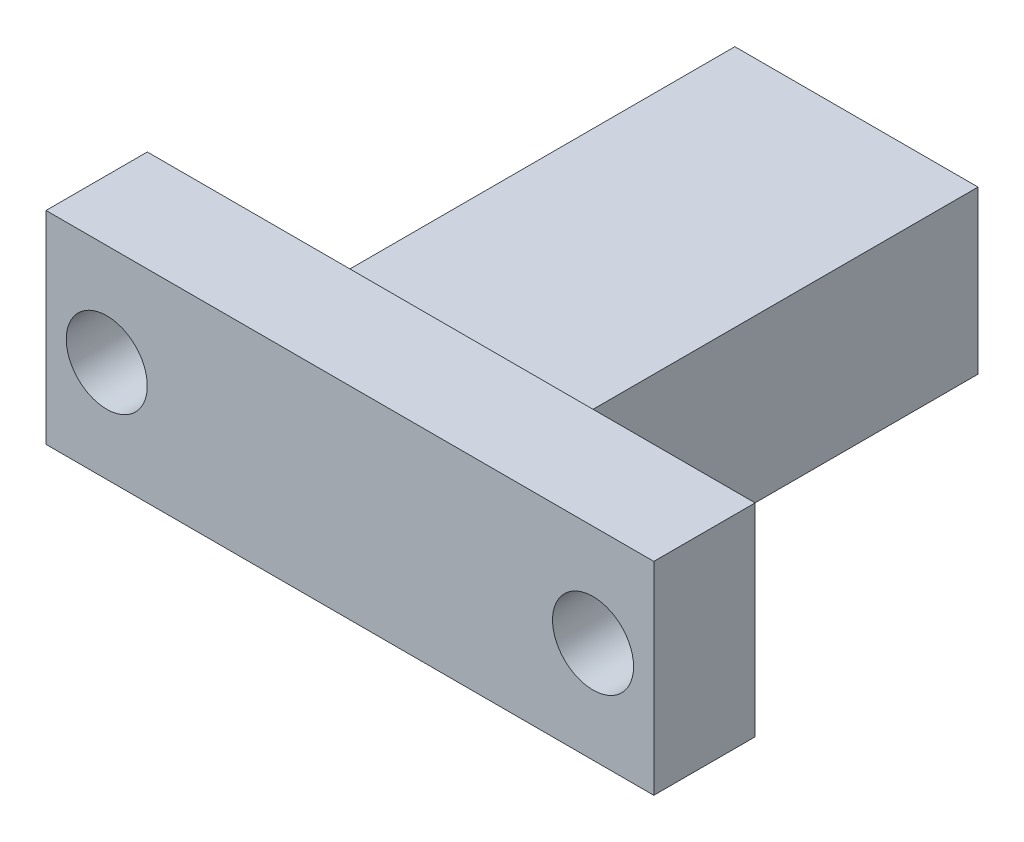
ISO-10303-21;
HEADER;
FILE_DESCRIPTION(('STEP AP214'),'2;1');
FILE_NAME('part.step','',(''),(''),'','','');
FILE_SCHEMA(('AUTOMOTIVE_DESIGN { 1 0 10303 214 1 1 1 1 }'));
ENDSEC;
DATA;
#1=APPLICATION_CONTEXT('core data for automotive mechanical design processes');
#2=APPLICATION_PROTOCOL_DEFINITION('international standard','automotive_design',2000,#1);
#3=PRODUCT_CONTEXT('',#1,'mechanical');
#4=PRODUCT('Part','Part','',(#3));
#5=PRODUCT_RELATED_PRODUCT_CATEGORY('part','',(#4));
#6=PRODUCT_DEFINITION_FORMATION('','',#4);
#7=PRODUCT_DEFINITION_CONTEXT('part definition',#1,'design');
#8=PRODUCT_DEFINITION('design','',#6,#7);
#9=PRODUCT_DEFINITION_SHAPE('','',#8);
#10=(LENGTH_UNIT() NAMED_UNIT(*) SI_UNIT(.MILLI.,.METRE.));
#11=(NAMED_UNIT(*) PLANE_ANGLE_UNIT() SI_UNIT($,.RADIAN.));
#12=(NAMED_UNIT(*) SI_UNIT($,.STERADIAN.) SOLID_ANGLE_UNIT());
#13=UNCERTAINTY_MEASURE_WITH_UNIT(LENGTH_MEASURE(1.E-05),#10,'distance_accuracy_value','');
#14=(GEOMETRIC_REPRESENTATION_CONTEXT(3) GLOBAL_UNCERTAINTY_ASSIGNED_CONTEXT((#13)) GLOBAL_UNIT_ASSIGNED_CONTEXT((#10,
#11,#12)) REPRESENTATION_CONTEXT('',''));
#15=CARTESIAN_POINT('',(0.,0.,0.));
#16=DIRECTION('',(0.,0.,1.));
#17=DIRECTION('',(1.,0.,0.));
#18=AXIS2_PLACEMENT_3D('',#15,#16,#17);
#19=CARTESIAN_POINT('',(0.,0.,0.));
#20=DIRECTION('',(0.,0.,-1.));
#21=DIRECTION('',(-1.,0.,0.));
#22=AXIS2_PLACEMENT_3D('',#19,#20,#21);
#23=PLANE('',#22);
#24=CARTESIAN_POINT('',(12.,0.,0.));
#25=DIRECTION('',(0.,0.,1.));
#26=DIRECTION('',(1.,0.,0.));
#27=AXIS2_PLACEMENT_3D('',#24,#25,#26);
#28=CIRCLE('',#27,2.);
#29=CARTESIAN_POINT('',(14.,0.,0.));
#30=VERTEX_POINT('',#29);
#31=EDGE_CURVE('E143',#30,#30,#28,.T.);
#32=ORIENTED_EDGE('',*,*,#31,.T.);
#33=EDGE_LOOP('',(#32));
#34=FACE_BOUND('',#33,.T.);
#35=DIRECTION('',(0.,1.,0.));
#36=VECTOR('',#35,1.);
#37=CARTESIAN_POINT('',(15.,-5.,0.));
#38=LINE('',#37,#36);
#39=CARTESIAN_POINT('',(15.,-5.,0.));
#40=VERTEX_POINT('',#39);
#41=CARTESIAN_POINT('',(15.,4.99999999999999,0.));
#42=VERTEX_POINT('',#41);
#43=EDGE_CURVE('E149',#40,#42,#38,.T.);
#44=ORIENTED_EDGE('',*,*,#43,.F.);
#45=DIRECTION('',(1.,0.,0.));
#46=VECTOR('',#45,1.);
#47=CARTESIAN_POINT('',(-15.,-5.,0.));
#48=LINE('',#47,#46);
#49=CARTESIAN_POINT('',(-15.,-5.,0.));
#50=VERTEX_POINT('',#49);
#51=EDGE_CURVE('E156',#50,#40,#48,.T.);
#52=ORIENTED_EDGE('',*,*,#51,.F.);
#53=DIRECTION('',(0.,-1.,0.));
#54=VECTOR('',#53,1.);
#55=CARTESIAN_POINT('',(-15.,-5.,0.));
#56=LINE('',#55,#54);
#57=CARTESIAN_POINT('',(-15.,4.99999999999999,0.));
#58=VERTEX_POINT('',#57);
#59=EDGE_CURVE('E167',#58,#50,#56,.T.);
#60=ORIENTED_EDGE('',*,*,#59,.F.);
#61=DIRECTION('',(-1.,0.,0.));
#62=VECTOR('',#61,1.);
#63=CARTESIAN_POINT('',(-15.,4.99999999999999,0.));
#64=LINE('',#63,#62);
#65=EDGE_CURVE('E165',#42,#58,#64,.T.);
#66=ORIENTED_EDGE('',*,*,#65,.F.);
#67=EDGE_LOOP('',(#44,#52,#60,#66));
#68=FACE_BOUND('',#67,.T.);
#69=CARTESIAN_POINT('',(-12.,0.,0.));
#70=DIRECTION('',(0.,0.,1.));
#71=DIRECTION('',(-1.,0.,0.));
#72=AXIS2_PLACEMENT_3D('',#69,#70,#71);
#73=CIRCLE('',#72,2.);
#74=CARTESIAN_POINT('',(-14.,0.,0.));
#75=VERTEX_POINT('',#74);
#76=EDGE_CURVE('E139',#75,#75,#73,.T.);
#77=ORIENTED_EDGE('',*,*,#76,.T.);
#78=EDGE_LOOP('',(#77));
#79=FACE_BOUND('',#78,.T.);
#80=DIRECTION('',(1.,0.,0.));
#81=VECTOR('',#80,1.);
#82=CARTESIAN_POINT('',(5.99999999999999,4.,0.));
#83=LINE('',#82,#81);
#84=CARTESIAN_POINT('',(-6.00000000000001,4.,0.));
#85=VERTEX_POINT('',#84);
#86=CARTESIAN_POINT('',(5.99999999999999,4.,0.));
#87=VERTEX_POINT('',#86);
#88=EDGE_CURVE('E218',#85,#87,#83,.T.);
#89=ORIENTED_EDGE('',*,*,#88,.F.);
#90=DIRECTION('',(0.,1.,0.));
#91=VECTOR('',#90,1.);
#92=CARTESIAN_POINT('',(-6.00000000000001,-4.,0.));
#93=LINE('',#92,#91);
#94=CARTESIAN_POINT('',(-6.00000000000001,-4.,0.));
#95=VERTEX_POINT('',#94);
#96=EDGE_CURVE('E119',#95,#85,#93,.T.);
#97=ORIENTED_EDGE('',*,*,#96,.F.);
#98=DIRECTION('',(-1.,0.,0.));
#99=VECTOR('',#98,1.);
#100=CARTESIAN_POINT('',(6.00000000000001,-4.,0.));
#101=LINE('',#100,#99);
#102=CARTESIAN_POINT('',(6.00000000000001,-4.,0.));
#103=VERTEX_POINT('',#102);
#104=EDGE_CURVE('E124',#103,#95,#101,.T.);
#105=ORIENTED_EDGE('',*,*,#104,.F.);
#106=DIRECTION('',(0.,-1.,0.));
#107=VECTOR('',#106,1.);
#108=CARTESIAN_POINT('',(6.00000000000001,-4.,0.));
#109=LINE('',#108,#107);
#110=EDGE_CURVE('E219',#87,#103,#109,.T.);
#111=ORIENTED_EDGE('',*,*,#110,.F.);
#112=EDGE_LOOP('',(#89,#97,#105,#111));
#113=FACE_BOUND('',#112,.T.);
#114=ADVANCED_FACE('F40',(#34,#68,#79,#113),#23,.T.);
#115=CARTESIAN_POINT('',(0.,0.,5.));
#116=DIRECTION('',(0.,0.,-1.));
#117=DIRECTION('',(-1.,0.,0.));
#118=AXIS2_PLACEMENT_3D('',#115,#116,#117);
#119=PLANE('',#118);
#120=DIRECTION('',(0.,1.,0.));
#121=VECTOR('',#120,1.);
#122=CARTESIAN_POINT('',(15.,-5.00000000000002,5.));
#123=LINE('',#122,#121);
#124=CARTESIAN_POINT('',(15.,-5.00000000000002,5.));
#125=VERTEX_POINT('',#124);
#126=CARTESIAN_POINT('',(15.,4.99999999999999,5.));
#127=VERTEX_POINT('',#126);
#128=EDGE_CURVE('E152',#125,#127,#123,.T.);
#129=ORIENTED_EDGE('',*,*,#128,.T.);
#130=DIRECTION('',(-1.,0.,0.));
#131=VECTOR('',#130,1.);
#132=CARTESIAN_POINT('',(-15.,4.99999999999999,5.));
#133=LINE('',#132,#131);
#134=CARTESIAN_POINT('',(-15.,4.99999999999999,5.));
#135=VERTEX_POINT('',#134);
#136=EDGE_CURVE('E155',#127,#135,#133,.T.);
#137=ORIENTED_EDGE('',*,*,#136,.T.);
#138=DIRECTION('',(0.,-1.,0.));
#139=VECTOR('',#138,1.);
#140=CARTESIAN_POINT('',(-15.,-5.00000000000002,5.));
#141=LINE('',#140,#139);
#142=CARTESIAN_POINT('',(-15.,-5.00000000000002,5.));
#143=VERTEX_POINT('',#142);
#144=EDGE_CURVE('E158',#135,#143,#141,.T.);
#145=ORIENTED_EDGE('',*,*,#144,.T.);
#146=DIRECTION('',(1.,0.,0.));
#147=VECTOR('',#146,1.);
#148=CARTESIAN_POINT('',(-15.,-5.00000000000002,5.));
#149=LINE('',#148,#147);
#150=EDGE_CURVE('E160',#143,#125,#149,.T.);
#151=ORIENTED_EDGE('',*,*,#150,.T.);
#152=EDGE_LOOP('',(#129,#137,#145,#151));
#153=FACE_BOUND('',#152,.T.);
#154=CARTESIAN_POINT('',(12.,0.,5.));
#155=DIRECTION('',(0.,0.,1.));
#156=DIRECTION('',(1.,0.,0.));
#157=AXIS2_PLACEMENT_3D('',#154,#155,#156);
#158=CIRCLE('',#157,2.);
#159=CARTESIAN_POINT('',(14.,0.,5.));
#160=VERTEX_POINT('',#159);
#161=EDGE_CURVE('E146',#160,#160,#158,.T.);
#162=ORIENTED_EDGE('',*,*,#161,.F.);
#163=EDGE_LOOP('',(#162));
#164=FACE_BOUND('',#163,.T.);
#165=CARTESIAN_POINT('',(-12.,0.,5.));
#166=DIRECTION('',(0.,0.,1.));
#167=DIRECTION('',(-1.,0.,0.));
#168=AXIS2_PLACEMENT_3D('',#165,#166,#167);
#169=CIRCLE('',#168,2.);
#170=CARTESIAN_POINT('',(-14.,0.,5.));
#171=VERTEX_POINT('',#170);
#172=EDGE_CURVE('E140',#171,#171,#169,.T.);
#173=ORIENTED_EDGE('',*,*,#172,.F.);
#174=EDGE_LOOP('',(#173));
#175=FACE_BOUND('',#174,.T.);
#176=ADVANCED_FACE('F198',(#153,#164,#175),#119,.F.);
#177=CARTESIAN_POINT('',(15.,-5.00000000000002,5.));
#178=DIRECTION('',(-1.,0.,0.));
#179=DIRECTION('',(0.,0.,1.));
#180=AXIS2_PLACEMENT_3D('',#177,#178,#179);
#181=PLANE('',#180);
#182=ORIENTED_EDGE('',*,*,#43,.T.);
#183=DIRECTION('',(0.,0.,-1.));
#184=VECTOR('',#183,1.);
#185=CARTESIAN_POINT('',(15.,4.99999999999999,5.));
#186=LINE('',#185,#184);
#187=EDGE_CURVE('E48',#127,#42,#186,.T.);
#188=ORIENTED_EDGE('',*,*,#187,.F.);
#189=ORIENTED_EDGE('',*,*,#128,.F.);
#190=DIRECTION('',(0.,0.,-1.));
#191=VECTOR('',#190,1.);
#192=CARTESIAN_POINT('',(15.,-5.00000000000002,5.));
#193=LINE('',#192,#191);
#194=EDGE_CURVE('E162',#125,#40,#193,.T.);
#195=ORIENTED_EDGE('',*,*,#194,.T.);
#196=EDGE_LOOP('',(#182,#188,#189,#195));
#197=FACE_BOUND('',#196,.T.);
#198=ADVANCED_FACE('F42',(#197),#181,.F.);
#199=CARTESIAN_POINT('',(-15.,4.99999999999999,5.));
#200=DIRECTION('',(0.,-1.,0.));
#201=DIRECTION('',(0.,0.,-1.));
#202=AXIS2_PLACEMENT_3D('',#199,#200,#201);
#203=PLANE('',#202);
#204=ORIENTED_EDGE('',*,*,#65,.T.);
#205=DIRECTION('',(0.,0.,-1.));
#206=VECTOR('',#205,1.);
#207=CARTESIAN_POINT('',(-15.,4.99999999999999,5.));
#208=LINE('',#207,#206);
#209=EDGE_CURVE('E175',#135,#58,#208,.T.);
#210=ORIENTED_EDGE('',*,*,#209,.F.);
#211=ORIENTED_EDGE('',*,*,#136,.F.);
#212=ORIENTED_EDGE('',*,*,#187,.T.);
#213=EDGE_LOOP('',(#204,#210,#211,#212));
#214=FACE_BOUND('',#213,.T.);
#215=ADVANCED_FACE('F180',(#214),#203,.F.);
#216=CARTESIAN_POINT('',(-15.,-5.00000000000002,5.));
#217=DIRECTION('',(1.,0.,0.));
#218=DIRECTION('',(0.,0.,-1.));
#219=AXIS2_PLACEMENT_3D('',#216,#217,#218);
#220=PLANE('',#219);
#221=ORIENTED_EDGE('',*,*,#59,.T.);
#222=DIRECTION('',(0.,0.,-1.));
#223=VECTOR('',#222,1.);
#224=CARTESIAN_POINT('',(-15.,-5.00000000000002,5.));
#225=LINE('',#224,#223);
#226=EDGE_CURVE('E172',#143,#50,#225,.T.);
#227=ORIENTED_EDGE('',*,*,#226,.F.);
#228=ORIENTED_EDGE('',*,*,#144,.F.);
#229=ORIENTED_EDGE('',*,*,#209,.T.);
#230=EDGE_LOOP('',(#221,#227,#228,#229));
#231=FACE_BOUND('',#230,.T.);
#232=ADVANCED_FACE('F192',(#231),#220,.F.);
#233=CARTESIAN_POINT('',(-15.,-5.00000000000002,5.));
#234=DIRECTION('',(0.,1.,0.));
#235=DIRECTION('',(0.,0.,1.));
#236=AXIS2_PLACEMENT_3D('',#233,#234,#235);
#237=PLANE('',#236);
#238=ORIENTED_EDGE('',*,*,#51,.T.);
#239=ORIENTED_EDGE('',*,*,#194,.F.);
#240=ORIENTED_EDGE('',*,*,#150,.F.);
#241=ORIENTED_EDGE('',*,*,#226,.T.);
#242=EDGE_LOOP('',(#238,#239,#240,#241));
#243=FACE_BOUND('',#242,.T.);
#244=ADVANCED_FACE('F196',(#243),#237,.F.);
#245=CARTESIAN_POINT('',(12.,0.,5.));
#246=DIRECTION('',(0.,0.,-1.));
#247=DIRECTION('',(-1.,0.,0.));
#248=AXIS2_PLACEMENT_3D('',#245,#246,#247);
#249=CYLINDRICAL_SURFACE('',#248,2.);
#250=ORIENTED_EDGE('',*,*,#161,.T.);
#251=EDGE_LOOP('',(#250));
#252=FACE_BOUND('',#251,.T.);
#253=ORIENTED_EDGE('',*,*,#31,.F.);
#254=EDGE_LOOP('',(#253));
#255=FACE_BOUND('',#254,.T.);
#256=ADVANCED_FACE('F209',(#252,#255),#249,.F.);
#257=CARTESIAN_POINT('',(-12.,0.,5.));
#258=DIRECTION('',(0.,0.,-1.));
#259=DIRECTION('',(-1.,0.,0.));
#260=AXIS2_PLACEMENT_3D('',#257,#258,#259);
#261=CYLINDRICAL_SURFACE('',#260,2.);
#262=ORIENTED_EDGE('',*,*,#172,.T.);
#263=EDGE_LOOP('',(#262));
#264=FACE_BOUND('',#263,.T.);
#265=ORIENTED_EDGE('',*,*,#76,.F.);
#266=EDGE_LOOP('',(#265));
#267=FACE_BOUND('',#266,.T.);
#268=ADVANCED_FACE('F206',(#264,#267),#261,.F.);
#269=CARTESIAN_POINT('',(-6.00000000000001,-4.,-20.));
#270=DIRECTION('',(1.,0.,0.));
#271=DIRECTION('',(0.,0.,-1.));
#272=AXIS2_PLACEMENT_3D('',#269,#270,#271);
#273=PLANE('',#272);
#274=DIRECTION('',(0.,0.,1.));
#275=VECTOR('',#274,1.);
#276=CARTESIAN_POINT('',(-6.00000000000001,-4.,-20.));
#277=LINE('',#276,#275);
#278=CARTESIAN_POINT('',(-6.00000000000001,-4.,-20.));
#279=VERTEX_POINT('',#278);
#280=CARTESIAN_POINT('',(-6.00000000000001,-4.,-15.));
#281=VERTEX_POINT('',#280);
#282=EDGE_CURVE('E118',#279,#281,#277,.T.);
#283=ORIENTED_EDGE('',*,*,#282,.T.);
#284=CARTESIAN_POINT('',(-6.00000000000001,-4.,-9.99999999999995));
#285=DIRECTION('',(1.,0.,0.));
#286=DIRECTION('',(0.,-1.,0.));
#287=AXIS2_PLACEMENT_3D('',#284,#285,#286);
#288=ELLIPSE('',#287,7.07106781186548,5.);
#289=CARTESIAN_POINT('',(-6.00000000000001,-4.,-4.99999999999995));
#290=VERTEX_POINT('',#289);
#291=EDGE_CURVE('E54',#281,#290,#288,.T.);
#292=ORIENTED_EDGE('',*,*,#291,.T.);
#293=EDGE_CURVE('E116',#290,#95,#277,.T.);
#294=ORIENTED_EDGE('',*,*,#293,.T.);
#295=ORIENTED_EDGE('',*,*,#96,.T.);
#296=DIRECTION('',(0.,0.,1.));
#297=VECTOR('',#296,1.);
#298=CARTESIAN_POINT('',(-6.00000000000001,4.,-20.));
#299=LINE('',#298,#297);
#300=CARTESIAN_POINT('',(-6.00000000000001,4.,-20.));
#301=VERTEX_POINT('',#300);
#302=EDGE_CURVE('E137',#301,#85,#299,.T.);
#303=ORIENTED_EDGE('',*,*,#302,.F.);
#304=DIRECTION('',(0.,1.,0.));
#305=VECTOR('',#304,1.);
#306=CARTESIAN_POINT('',(-6.00000000000001,-4.,-20.));
#307=LINE('',#306,#305);
#308=EDGE_CURVE('E228',#279,#301,#307,.T.);
#309=ORIENTED_EDGE('',*,*,#308,.F.);
#310=EDGE_LOOP('',(#283,#292,#294,#295,#303,#309));
#311=FACE_BOUND('',#310,.T.);
#312=ADVANCED_FACE('F114',(#311),#273,.F.);
#313=CARTESIAN_POINT('',(5.99999999999999,4.,-20.));
#314=DIRECTION('',(0.,-1.,0.));
#315=DIRECTION('',(0.,0.,-1.));
#316=AXIS2_PLACEMENT_3D('',#313,#314,#315);
#317=PLANE('',#316);
#318=ORIENTED_EDGE('',*,*,#88,.T.);
#319=DIRECTION('',(0.,0.,1.));
#320=VECTOR('',#319,1.);
#321=CARTESIAN_POINT('',(5.99999999999999,4.,-20.));
#322=LINE('',#321,#320);
#323=CARTESIAN_POINT('',(5.99999999999999,4.,-20.));
#324=VERTEX_POINT('',#323);
#325=EDGE_CURVE('E134',#324,#87,#322,.T.);
#326=ORIENTED_EDGE('',*,*,#325,.F.);
#327=DIRECTION('',(1.,0.,0.));
#328=VECTOR('',#327,1.);
#329=CARTESIAN_POINT('',(5.99999999999999,4.,-20.));
#330=LINE('',#329,#328);
#331=EDGE_CURVE('E226',#301,#324,#330,.T.);
#332=ORIENTED_EDGE('',*,*,#331,.F.);
#333=ORIENTED_EDGE('',*,*,#302,.T.);
#334=EDGE_LOOP('',(#318,#326,#332,#333));
#335=FACE_BOUND('',#334,.T.);
#336=ADVANCED_FACE('F252',(#335),#317,.F.);
#337=CARTESIAN_POINT('',(6.00000000000001,-4.,-20.));
#338=DIRECTION('',(-1.,0.,0.));
#339=DIRECTION('',(0.,0.,1.));
#340=AXIS2_PLACEMENT_3D('',#337,#338,#339);
#341=PLANE('',#340);
#342=ORIENTED_EDGE('',*,*,#110,.T.);
#343=DIRECTION('',(0.,0.,1.));
#344=VECTOR('',#343,1.);
#345=CARTESIAN_POINT('',(6.00000000000001,-4.,-20.));
#346=LINE('',#345,#344);
#347=CARTESIAN_POINT('',(6.00000000000001,-4.,-20.));
#348=VERTEX_POINT('',#347);
#349=EDGE_CURVE('E61',#348,#103,#346,.T.);
#350=ORIENTED_EDGE('',*,*,#349,.F.);
#351=DIRECTION('',(0.,-1.,0.));
#352=VECTOR('',#351,1.);
#353=CARTESIAN_POINT('',(6.00000000000001,-4.,-20.));
#354=LINE('',#353,#352);
#355=EDGE_CURVE('E128',#324,#348,#354,.T.);
#356=ORIENTED_EDGE('',*,*,#355,.F.);
#357=ORIENTED_EDGE('',*,*,#325,.T.);
#358=EDGE_LOOP('',(#342,#350,#356,#357));
#359=FACE_BOUND('',#358,.T.);
#360=ADVANCED_FACE('F249',(#359),#341,.F.);
#361=CARTESIAN_POINT('',(6.00000000000001,-4.,-20.));
#362=DIRECTION('',(0.,1.,0.));
#363=DIRECTION('',(0.,0.,1.));
#364=AXIS2_PLACEMENT_3D('',#361,#362,#363);
#365=PLANE('',#364);
#366=ORIENTED_EDGE('',*,*,#293,.F.);
#367=CARTESIAN_POINT('',(-6.00000000000001,-4.,-9.99999999999995));
#368=DIRECTION('',(0.,1.,0.));
#369=DIRECTION('',(-1.,0.,0.));
#370=AXIS2_PLACEMENT_3D('',#367,#368,#369);
#371=ELLIPSE('',#370,7.07106781186548,5.);
#372=EDGE_CURVE('E11',#290,#281,#371,.T.);
#373=ORIENTED_EDGE('',*,*,#372,.T.);
#374=ORIENTED_EDGE('',*,*,#282,.F.);
#375=DIRECTION('',(-1.,0.,0.));
#376=VECTOR('',#375,1.);
#377=CARTESIAN_POINT('',(6.00000000000001,-4.,-20.));
#378=LINE('',#377,#376);
#379=EDGE_CURVE('E126',#348,#279,#378,.T.);
#380=ORIENTED_EDGE('',*,*,#379,.F.);
#381=ORIENTED_EDGE('',*,*,#349,.T.);
#382=ORIENTED_EDGE('',*,*,#104,.T.);
#383=EDGE_LOOP('',(#366,#373,#374,#380,#381,#382));
#384=FACE_BOUND('',#383,.T.);
#385=ADVANCED_FACE('F122',(#384),#365,.F.);
#386=CARTESIAN_POINT('',(0.,0.,-20.));
#387=DIRECTION('',(0.,0.,1.));
#388=DIRECTION('',(1.,0.,0.));
#389=AXIS2_PLACEMENT_3D('',#386,#387,#388);
#390=PLANE('',#389);
#391=ORIENTED_EDGE('',*,*,#308,.T.);
#392=ORIENTED_EDGE('',*,*,#331,.T.);
#393=ORIENTED_EDGE('',*,*,#355,.T.);
#394=ORIENTED_EDGE('',*,*,#379,.T.);
#395=EDGE_LOOP('',(#391,#392,#393,#394));
#396=FACE_BOUND('',#395,.T.);
#397=ADVANCED_FACE('F237',(#396),#390,.F.);
#398=CARTESIAN_POINT('',(-1.75735931288071,0.24264068711928,-10.));
#399=DIRECTION('',(-0.707106781186547,-0.707106781186548,0.));
#400=DIRECTION('',(0.707106781186548,-0.707106781186547,0.));
#401=AXIS2_PLACEMENT_3D('',#398,#399,#400);
#402=CYLINDRICAL_SURFACE('',#401,5.);
#403=CARTESIAN_POINT('',(-1.75735931288071,0.24264068711928,-10.));
#404=DIRECTION('',(-0.707106781186547,-0.707106781186548,0.));
#405=DIRECTION('',(0.707106781186548,-0.707106781186547,0.));
#406=AXIS2_PLACEMENT_3D('',#403,#404,#405);
#407=CIRCLE('',#406,5.);
#408=CARTESIAN_POINT('',(1.77817459305203,-3.29289321881346,-10.));
#409=VERTEX_POINT('',#408);
#410=EDGE_CURVE('E120',#409,#409,#407,.T.);
#411=ORIENTED_EDGE('',*,*,#410,.F.);
#412=EDGE_LOOP('',(#411));
#413=FACE_BOUND('',#412,.T.);
#414=ORIENTED_EDGE('',*,*,#372,.F.);
#415=ORIENTED_EDGE('',*,*,#291,.F.);
#416=EDGE_LOOP('',(#414,#415));
#417=FACE_BOUND('',#416,.T.);
#418=ADVANCED_FACE('F109',(#413,#417),#402,.F.);
#419=CARTESIAN_POINT('',(-1.75735931288071,0.24264068711928,-10.));
#420=DIRECTION('',(-0.707106781186547,-0.707106781186548,0.));
#421=DIRECTION('',(0.707106781186548,-0.707106781186547,0.));
#422=AXIS2_PLACEMENT_3D('',#419,#420,#421);
#423=PLANE('',#422);
#424=ORIENTED_EDGE('',*,*,#410,.T.);
#425=EDGE_LOOP('',(#424));
#426=FACE_BOUND('',#425,.T.);
#427=ADVANCED_FACE('F234',(#426),#423,.T.);
#428=CLOSED_SHELL('',(#114,#176,#198,#215,#232,#244,#256,#268,#312,#336,#360,#385,#397,#418,#427));
#429=MANIFOLD_SOLID_BREP('B2',#428);
#430=ADVANCED_BREP_SHAPE_REPRESENTATION('',(#18,#429),#14);
#431=SHAPE_DEFINITION_REPRESENTATION(#9,#430);
ENDSEC;
END-ISO-10303-21;
